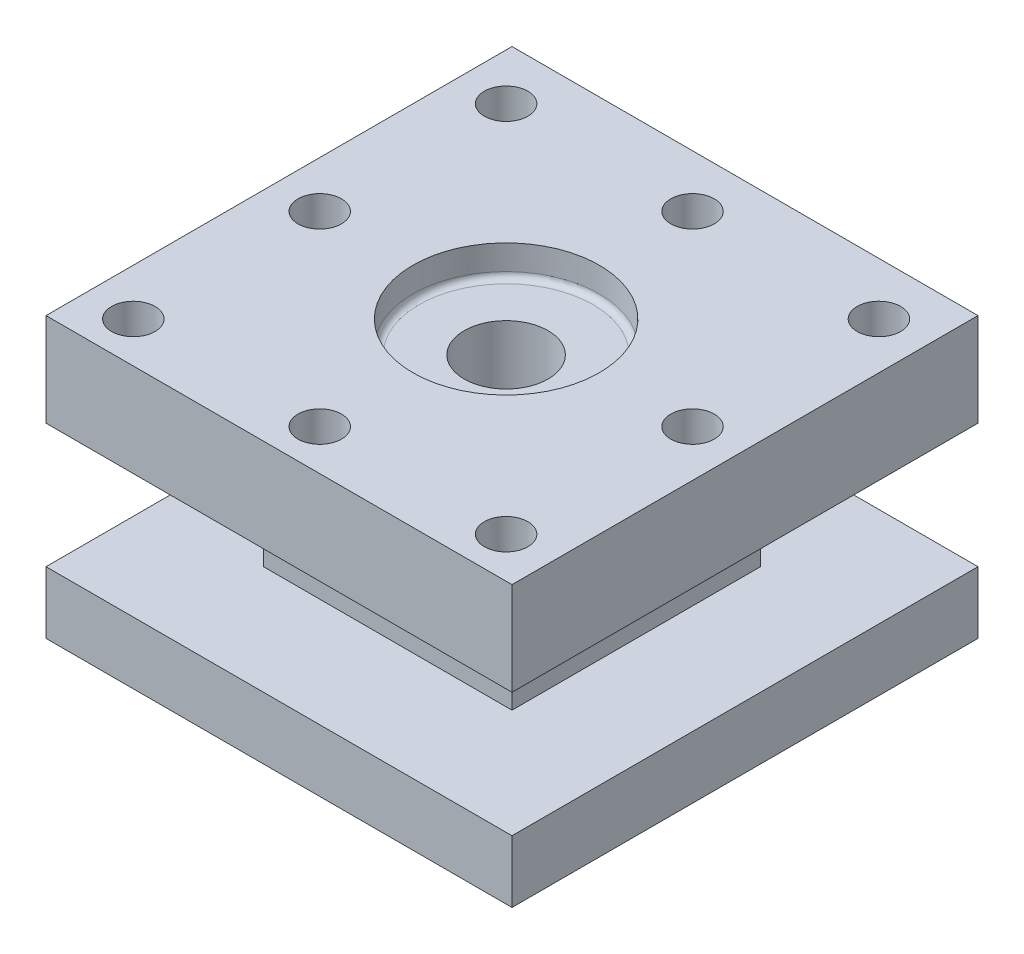
ISO-10303-21;
HEADER;
FILE_DESCRIPTION(('STEP AP214'),'2;1');
FILE_NAME('part.step','',(''),(''),'','','');
FILE_SCHEMA(('AUTOMOTIVE_DESIGN { 1 0 10303 214 1 1 1 1 }'));
ENDSEC;
DATA;
#1=APPLICATION_CONTEXT('core data for automotive mechanical design processes');
#2=APPLICATION_PROTOCOL_DEFINITION('international standard','automotive_design',2000,#1);
#3=PRODUCT_CONTEXT('',#1,'mechanical');
#4=PRODUCT('Part','Part','',(#3));
#5=PRODUCT_RELATED_PRODUCT_CATEGORY('part','',(#4));
#6=PRODUCT_DEFINITION_FORMATION('','',#4);
#7=PRODUCT_DEFINITION_CONTEXT('part definition',#1,'design');
#8=PRODUCT_DEFINITION('design','',#6,#7);
#9=PRODUCT_DEFINITION_SHAPE('','',#8);
#10=(LENGTH_UNIT() NAMED_UNIT(*) SI_UNIT(.MILLI.,.METRE.));
#11=(NAMED_UNIT(*) PLANE_ANGLE_UNIT() SI_UNIT($,.RADIAN.));
#12=(NAMED_UNIT(*) SI_UNIT($,.STERADIAN.) SOLID_ANGLE_UNIT());
#13=UNCERTAINTY_MEASURE_WITH_UNIT(LENGTH_MEASURE(1.E-05),#10,'distance_accuracy_value','');
#14=(GEOMETRIC_REPRESENTATION_CONTEXT(3) GLOBAL_UNCERTAINTY_ASSIGNED_CONTEXT((#13)) GLOBAL_UNIT_ASSIGNED_CONTEXT((#10,
#11,#12)) REPRESENTATION_CONTEXT('',''));
#15=CARTESIAN_POINT('',(0.,0.,0.));
#16=DIRECTION('',(0.,0.,1.));
#17=DIRECTION('',(1.,0.,0.));
#18=AXIS2_PLACEMENT_3D('',#15,#16,#17);
#19=CARTESIAN_POINT('',(0.,-30.,0.));
#20=DIRECTION('',(0.,1.,0.));
#21=DIRECTION('',(0.,0.,1.));
#22=AXIS2_PLACEMENT_3D('',#19,#20,#21);
#23=PLANE('',#22);
#24=DIRECTION('',(-1.,0.,0.));
#25=VECTOR('',#24,1.);
#26=CARTESIAN_POINT('',(40.,-30.,43.));
#27=LINE('',#26,#25);
#28=CARTESIAN_POINT('',(-43.,-30.,43.));
#29=VERTEX_POINT('',#28);
#30=CARTESIAN_POINT('',(43.,-30.,43.));
#31=VERTEX_POINT('',#30);
#32=EDGE_CURVE('E399',#29,#31,#27,.F.);
#33=ORIENTED_EDGE('',*,*,#32,.T.);
#34=DIRECTION('',(0.,0.,1.));
#35=VECTOR('',#34,1.);
#36=CARTESIAN_POINT('',(43.,-30.,-40.));
#37=LINE('',#36,#35);
#38=CARTESIAN_POINT('',(43.,-30.,-43.));
#39=VERTEX_POINT('',#38);
#40=EDGE_CURVE('E410',#31,#39,#37,.F.);
#41=ORIENTED_EDGE('',*,*,#40,.T.);
#42=DIRECTION('',(1.,0.,0.));
#43=VECTOR('',#42,1.);
#44=CARTESIAN_POINT('',(-40.,-30.,-43.));
#45=LINE('',#44,#43);
#46=CARTESIAN_POINT('',(-43.,-30.,-43.));
#47=VERTEX_POINT('',#46);
#48=EDGE_CURVE('E404',#39,#47,#45,.F.);
#49=ORIENTED_EDGE('',*,*,#48,.T.);
#50=DIRECTION('',(0.,0.,-1.));
#51=VECTOR('',#50,1.);
#52=CARTESIAN_POINT('',(-43.,-30.,40.));
#53=LINE('',#52,#51);
#54=EDGE_CURVE('E402',#47,#29,#53,.F.);
#55=ORIENTED_EDGE('',*,*,#54,.T.);
#56=EDGE_LOOP('',(#33,#41,#49,#55));
#57=FACE_BOUND('',#56,.T.);
#58=CARTESIAN_POINT('',(60.,-30.,61.8916213058325));
#59=DIRECTION('',(0.,1.,0.));
#60=DIRECTION('',(0.,0.,1.));
#61=AXIS2_PLACEMENT_3D('',#58,#59,#60);
#62=CIRCLE('',#61,6.99999999999999);
#63=CARTESIAN_POINT('',(60.,-30.,68.8916213058325));
#64=VERTEX_POINT('',#63);
#65=EDGE_CURVE('E210',#64,#64,#62,.T.);
#66=ORIENTED_EDGE('',*,*,#65,.T.);
#67=EDGE_LOOP('',(#66));
#68=FACE_BOUND('',#67,.T.);
#69=CARTESIAN_POINT('',(-60.,-30.,-58.1083786941675));
#70=DIRECTION('',(0.,1.,0.));
#71=DIRECTION('',(0.,0.,1.));
#72=AXIS2_PLACEMENT_3D('',#69,#70,#71);
#73=CIRCLE('',#72,6.99999999999999);
#74=CARTESIAN_POINT('',(-60.,-30.,-51.1083786941675));
#75=VERTEX_POINT('',#74);
#76=EDGE_CURVE('E214',#75,#75,#73,.T.);
#77=ORIENTED_EDGE('',*,*,#76,.T.);
#78=EDGE_LOOP('',(#77));
#79=FACE_BOUND('',#78,.T.);
#80=CARTESIAN_POINT('',(-60.,-30.,61.8916213058325));
#81=DIRECTION('',(0.,1.,0.));
#82=DIRECTION('',(0.,0.,1.));
#83=AXIS2_PLACEMENT_3D('',#80,#81,#82);
#84=CIRCLE('',#83,6.99999999999999);
#85=CARTESIAN_POINT('',(-60.,-30.,68.8916213058325));
#86=VERTEX_POINT('',#85);
#87=EDGE_CURVE('E224',#86,#86,#84,.T.);
#88=ORIENTED_EDGE('',*,*,#87,.T.);
#89=EDGE_LOOP('',(#88));
#90=FACE_BOUND('',#89,.T.);
#91=CARTESIAN_POINT('',(60.,-30.,-58.1083786941675));
#92=DIRECTION('',(0.,1.,0.));
#93=DIRECTION('',(0.,0.,1.));
#94=AXIS2_PLACEMENT_3D('',#91,#92,#93);
#95=CIRCLE('',#94,6.99999999999999);
#96=CARTESIAN_POINT('',(60.,-30.,-51.1083786941675));
#97=VERTEX_POINT('',#96);
#98=EDGE_CURVE('E231',#97,#97,#95,.T.);
#99=ORIENTED_EDGE('',*,*,#98,.T.);
#100=EDGE_LOOP('',(#99));
#101=FACE_BOUND('',#100,.T.);
#102=CARTESIAN_POINT('',(0.,-30.,-58.1083786941675));
#103=DIRECTION('',(0.,1.,0.));
#104=DIRECTION('',(0.,0.,1.));
#105=AXIS2_PLACEMENT_3D('',#102,#103,#104);
#106=CIRCLE('',#105,6.99999999999999);
#107=CARTESIAN_POINT('',(0.,-30.,-51.1083786941675));
#108=VERTEX_POINT('',#107);
#109=EDGE_CURVE('E239',#108,#108,#106,.T.);
#110=ORIENTED_EDGE('',*,*,#109,.T.);
#111=EDGE_LOOP('',(#110));
#112=FACE_BOUND('',#111,.T.);
#113=CARTESIAN_POINT('',(-60.,-30.,1.89162130583248));
#114=DIRECTION('',(0.,1.,0.));
#115=DIRECTION('',(0.,0.,1.));
#116=AXIS2_PLACEMENT_3D('',#113,#114,#115);
#117=CIRCLE('',#116,6.99999999999999);
#118=CARTESIAN_POINT('',(-60.,-30.,8.89162130583247));
#119=VERTEX_POINT('',#118);
#120=EDGE_CURVE('E247',#119,#119,#117,.T.);
#121=ORIENTED_EDGE('',*,*,#120,.T.);
#122=EDGE_LOOP('',(#121));
#123=FACE_BOUND('',#122,.T.);
#124=CARTESIAN_POINT('',(60.,-30.,1.89162130583248));
#125=DIRECTION('',(0.,1.,0.));
#126=DIRECTION('',(0.,0.,1.));
#127=AXIS2_PLACEMENT_3D('',#124,#125,#126);
#128=CIRCLE('',#127,6.99999999999999);
#129=CARTESIAN_POINT('',(60.,-30.,8.89162130583247));
#130=VERTEX_POINT('',#129);
#131=EDGE_CURVE('E254',#130,#130,#128,.T.);
#132=ORIENTED_EDGE('',*,*,#131,.T.);
#133=EDGE_LOOP('',(#132));
#134=FACE_BOUND('',#133,.T.);
#135=CARTESIAN_POINT('',(0.,-30.,61.8916213058325));
#136=DIRECTION('',(0.,1.,0.));
#137=DIRECTION('',(0.,0.,1.));
#138=AXIS2_PLACEMENT_3D('',#135,#136,#137);
#139=CIRCLE('',#138,6.99999999999999);
#140=CARTESIAN_POINT('',(0.,-30.,68.8916213058325));
#141=VERTEX_POINT('',#140);
#142=EDGE_CURVE('E263',#141,#141,#139,.T.);
#143=ORIENTED_EDGE('',*,*,#142,.T.);
#144=EDGE_LOOP('',(#143));
#145=FACE_BOUND('',#144,.T.);
#146=DIRECTION('',(0.,0.,-1.));
#147=VECTOR('',#146,1.);
#148=CARTESIAN_POINT('',(75.,-30.,-75.));
#149=LINE('',#148,#147);
#150=CARTESIAN_POINT('',(75.,-30.,75.));
#151=VERTEX_POINT('',#150);
#152=CARTESIAN_POINT('',(75.,-30.,-75.));
#153=VERTEX_POINT('',#152);
#154=EDGE_CURVE('E353',#151,#153,#149,.T.);
#155=ORIENTED_EDGE('',*,*,#154,.F.);
#156=DIRECTION('',(1.,0.,0.));
#157=VECTOR('',#156,1.);
#158=CARTESIAN_POINT('',(-75.,-30.,75.));
#159=LINE('',#158,#157);
#160=CARTESIAN_POINT('',(-75.,-30.,75.));
#161=VERTEX_POINT('',#160);
#162=EDGE_CURVE('E365',#161,#151,#159,.T.);
#163=ORIENTED_EDGE('',*,*,#162,.F.);
#164=DIRECTION('',(0.,0.,1.));
#165=VECTOR('',#164,1.);
#166=CARTESIAN_POINT('',(-75.,-30.,-75.));
#167=LINE('',#166,#165);
#168=CARTESIAN_POINT('',(-75.,-30.,-75.));
#169=VERTEX_POINT('',#168);
#170=EDGE_CURVE('E360',#169,#161,#167,.T.);
#171=ORIENTED_EDGE('',*,*,#170,.F.);
#172=DIRECTION('',(-1.,0.,0.));
#173=VECTOR('',#172,1.);
#174=CARTESIAN_POINT('',(-75.,-30.,-75.));
#175=LINE('',#174,#173);
#176=EDGE_CURVE('E352',#153,#169,#175,.T.);
#177=ORIENTED_EDGE('',*,*,#176,.F.);
#178=EDGE_LOOP('',(#155,#163,#171,#177));
#179=FACE_BOUND('',#178,.T.);
#180=ADVANCED_FACE('F48',(#57,#68,#79,#90,#101,#112,#123,#134,#145,#179),#23,.F.);
#181=CARTESIAN_POINT('',(75.,-30.,-75.));
#182=DIRECTION('',(1.,0.,0.));
#183=DIRECTION('',(0.,0.,-1.));
#184=AXIS2_PLACEMENT_3D('',#181,#182,#183);
#185=PLANE('',#184);
#186=DIRECTION('',(0.,0.,-1.));
#187=VECTOR('',#186,1.);
#188=CARTESIAN_POINT('',(75.,0.,-75.));
#189=LINE('',#188,#187);
#190=CARTESIAN_POINT('',(75.,0.,75.));
#191=VERTEX_POINT('',#190);
#192=CARTESIAN_POINT('',(75.,0.,-75.));
#193=VERTEX_POINT('',#192);
#194=EDGE_CURVE('E348',#191,#193,#189,.T.);
#195=ORIENTED_EDGE('',*,*,#194,.F.);
#196=DIRECTION('',(0.,1.,0.));
#197=VECTOR('',#196,1.);
#198=CARTESIAN_POINT('',(75.,-30.,75.));
#199=LINE('',#198,#197);
#200=EDGE_CURVE('E382',#151,#191,#199,.T.);
#201=ORIENTED_EDGE('',*,*,#200,.F.);
#202=ORIENTED_EDGE('',*,*,#154,.T.);
#203=DIRECTION('',(0.,1.,0.));
#204=VECTOR('',#203,1.);
#205=CARTESIAN_POINT('',(75.,-30.,-75.));
#206=LINE('',#205,#204);
#207=EDGE_CURVE('E366',#153,#193,#206,.T.);
#208=ORIENTED_EDGE('',*,*,#207,.T.);
#209=EDGE_LOOP('',(#195,#201,#202,#208));
#210=FACE_BOUND('',#209,.T.);
#211=ADVANCED_FACE('F449',(#210),#185,.T.);
#212=CARTESIAN_POINT('',(-75.,-30.,75.));
#213=DIRECTION('',(0.,0.,1.));
#214=DIRECTION('',(1.,0.,0.));
#215=AXIS2_PLACEMENT_3D('',#212,#213,#214);
#216=PLANE('',#215);
#217=DIRECTION('',(1.,0.,0.));
#218=VECTOR('',#217,1.);
#219=CARTESIAN_POINT('',(-75.,0.,75.));
#220=LINE('',#219,#218);
#221=CARTESIAN_POINT('',(-75.,0.,75.));
#222=VERTEX_POINT('',#221);
#223=EDGE_CURVE('E356',#222,#191,#220,.T.);
#224=ORIENTED_EDGE('',*,*,#223,.F.);
#225=DIRECTION('',(0.,1.,0.));
#226=VECTOR('',#225,1.);
#227=CARTESIAN_POINT('',(-75.,-30.,75.));
#228=LINE('',#227,#226);
#229=EDGE_CURVE('E390',#161,#222,#228,.T.);
#230=ORIENTED_EDGE('',*,*,#229,.F.);
#231=ORIENTED_EDGE('',*,*,#162,.T.);
#232=ORIENTED_EDGE('',*,*,#200,.T.);
#233=EDGE_LOOP('',(#224,#230,#231,#232));
#234=FACE_BOUND('',#233,.T.);
#235=ADVANCED_FACE('F460',(#234),#216,.T.);
#236=CARTESIAN_POINT('',(-75.,-30.,-75.));
#237=DIRECTION('',(-1.,0.,0.));
#238=DIRECTION('',(0.,0.,1.));
#239=AXIS2_PLACEMENT_3D('',#236,#237,#238);
#240=PLANE('',#239);
#241=DIRECTION('',(0.,0.,1.));
#242=VECTOR('',#241,1.);
#243=CARTESIAN_POINT('',(-75.,0.,-75.));
#244=LINE('',#243,#242);
#245=CARTESIAN_POINT('',(-75.,0.,-75.));
#246=VERTEX_POINT('',#245);
#247=EDGE_CURVE('E376',#246,#222,#244,.T.);
#248=ORIENTED_EDGE('',*,*,#247,.F.);
#249=DIRECTION('',(0.,1.,0.));
#250=VECTOR('',#249,1.);
#251=CARTESIAN_POINT('',(-75.,-30.,-75.));
#252=LINE('',#251,#250);
#253=EDGE_CURVE('E388',#169,#246,#252,.T.);
#254=ORIENTED_EDGE('',*,*,#253,.F.);
#255=ORIENTED_EDGE('',*,*,#170,.T.);
#256=ORIENTED_EDGE('',*,*,#229,.T.);
#257=EDGE_LOOP('',(#248,#254,#255,#256));
#258=FACE_BOUND('',#257,.T.);
#259=ADVANCED_FACE('F472',(#258),#240,.T.);
#260=CARTESIAN_POINT('',(-75.,-30.,-75.));
#261=DIRECTION('',(0.,0.,-1.));
#262=DIRECTION('',(-1.,0.,0.));
#263=AXIS2_PLACEMENT_3D('',#260,#261,#262);
#264=PLANE('',#263);
#265=DIRECTION('',(-1.,0.,0.));
#266=VECTOR('',#265,1.);
#267=CARTESIAN_POINT('',(-75.,0.,-75.));
#268=LINE('',#267,#266);
#269=EDGE_CURVE('E375',#193,#246,#268,.T.);
#270=ORIENTED_EDGE('',*,*,#269,.F.);
#271=ORIENTED_EDGE('',*,*,#207,.F.);
#272=ORIENTED_EDGE('',*,*,#176,.T.);
#273=ORIENTED_EDGE('',*,*,#253,.T.);
#274=EDGE_LOOP('',(#270,#271,#272,#273));
#275=FACE_BOUND('',#274,.T.);
#276=ADVANCED_FACE('F469',(#275),#264,.T.);
#277=CARTESIAN_POINT('',(0.,0.,0.));
#278=DIRECTION('',(0.,1.,0.));
#279=DIRECTION('',(0.,0.,1.));
#280=AXIS2_PLACEMENT_3D('',#277,#278,#279);
#281=PLANE('',#280);
#282=CARTESIAN_POINT('',(60.,0.,61.8916213058325));
#283=DIRECTION('',(0.,1.,0.));
#284=DIRECTION('',(0.,0.,1.));
#285=AXIS2_PLACEMENT_3D('',#282,#283,#284);
#286=CIRCLE('',#285,6.99999999999999);
#287=CARTESIAN_POINT('',(60.,0.,68.8916213058325));
#288=VERTEX_POINT('',#287);
#289=EDGE_CURVE('E201',#288,#288,#286,.T.);
#290=ORIENTED_EDGE('',*,*,#289,.F.);
#291=EDGE_LOOP('',(#290));
#292=FACE_BOUND('',#291,.T.);
#293=CARTESIAN_POINT('',(-60.,0.,-58.1083786941675));
#294=DIRECTION('',(0.,1.,0.));
#295=DIRECTION('',(0.,0.,1.));
#296=AXIS2_PLACEMENT_3D('',#293,#294,#295);
#297=CIRCLE('',#296,6.99999999999999);
#298=CARTESIAN_POINT('',(-60.,0.,-51.1083786941675));
#299=VERTEX_POINT('',#298);
#300=EDGE_CURVE('E211',#299,#299,#297,.T.);
#301=ORIENTED_EDGE('',*,*,#300,.F.);
#302=EDGE_LOOP('',(#301));
#303=FACE_BOUND('',#302,.T.);
#304=CARTESIAN_POINT('',(-60.,0.,61.8916213058325));
#305=DIRECTION('',(0.,1.,0.));
#306=DIRECTION('',(0.,0.,1.));
#307=AXIS2_PLACEMENT_3D('',#304,#305,#306);
#308=CIRCLE('',#307,6.99999999999999);
#309=CARTESIAN_POINT('',(-60.,0.,68.8916213058325));
#310=VERTEX_POINT('',#309);
#311=EDGE_CURVE('E218',#310,#310,#308,.T.);
#312=ORIENTED_EDGE('',*,*,#311,.F.);
#313=EDGE_LOOP('',(#312));
#314=FACE_BOUND('',#313,.T.);
#315=CARTESIAN_POINT('',(60.,0.,-58.1083786941675));
#316=DIRECTION('',(0.,1.,0.));
#317=DIRECTION('',(0.,0.,1.));
#318=AXIS2_PLACEMENT_3D('',#315,#316,#317);
#319=CIRCLE('',#318,6.99999999999999);
#320=CARTESIAN_POINT('',(60.,0.,-51.1083786941675));
#321=VERTEX_POINT('',#320);
#322=EDGE_CURVE('E230',#321,#321,#319,.T.);
#323=ORIENTED_EDGE('',*,*,#322,.F.);
#324=EDGE_LOOP('',(#323));
#325=FACE_BOUND('',#324,.T.);
#326=CARTESIAN_POINT('',(0.,0.,-58.1083786941675));
#327=DIRECTION('',(0.,1.,0.));
#328=DIRECTION('',(0.,0.,1.));
#329=AXIS2_PLACEMENT_3D('',#326,#327,#328);
#330=CIRCLE('',#329,6.99999999999999);
#331=CARTESIAN_POINT('',(0.,0.,-51.1083786941675));
#332=VERTEX_POINT('',#331);
#333=EDGE_CURVE('E235',#332,#332,#330,.T.);
#334=ORIENTED_EDGE('',*,*,#333,.F.);
#335=EDGE_LOOP('',(#334));
#336=FACE_BOUND('',#335,.T.);
#337=CARTESIAN_POINT('',(-60.,0.,1.89162130583248));
#338=DIRECTION('',(0.,1.,0.));
#339=DIRECTION('',(0.,0.,1.));
#340=AXIS2_PLACEMENT_3D('',#337,#338,#339);
#341=CIRCLE('',#340,6.99999999999999);
#342=CARTESIAN_POINT('',(-60.,0.,8.89162130583247));
#343=VERTEX_POINT('',#342);
#344=EDGE_CURVE('E241',#343,#343,#341,.T.);
#345=ORIENTED_EDGE('',*,*,#344,.F.);
#346=EDGE_LOOP('',(#345));
#347=FACE_BOUND('',#346,.T.);
#348=CARTESIAN_POINT('',(60.,0.,1.89162130583248));
#349=DIRECTION('',(0.,1.,0.));
#350=DIRECTION('',(0.,0.,1.));
#351=AXIS2_PLACEMENT_3D('',#348,#349,#350);
#352=CIRCLE('',#351,6.99999999999999);
#353=CARTESIAN_POINT('',(60.,0.,8.89162130583247));
#354=VERTEX_POINT('',#353);
#355=EDGE_CURVE('E253',#354,#354,#352,.T.);
#356=ORIENTED_EDGE('',*,*,#355,.F.);
#357=EDGE_LOOP('',(#356));
#358=FACE_BOUND('',#357,.T.);
#359=CARTESIAN_POINT('',(0.,0.,61.8916213058325));
#360=DIRECTION('',(0.,1.,0.));
#361=DIRECTION('',(0.,0.,1.));
#362=AXIS2_PLACEMENT_3D('',#359,#360,#361);
#363=CIRCLE('',#362,6.99999999999999);
#364=CARTESIAN_POINT('',(0.,0.,68.8916213058325));
#365=VERTEX_POINT('',#364);
#366=EDGE_CURVE('E259',#365,#365,#363,.T.);
#367=ORIENTED_EDGE('',*,*,#366,.F.);
#368=EDGE_LOOP('',(#367));
#369=FACE_BOUND('',#368,.T.);
#370=CARTESIAN_POINT('',(0.,0.,1.89162130583249));
#371=DIRECTION('',(0.,1.,0.));
#372=DIRECTION('',(0.,0.,1.));
#373=AXIS2_PLACEMENT_3D('',#370,#371,#372);
#374=CIRCLE('',#373,30.);
#375=CARTESIAN_POINT('',(0.,0.,31.8916213058325));
#376=VERTEX_POINT('',#375);
#377=EDGE_CURVE('E270',#376,#376,#374,.T.);
#378=ORIENTED_EDGE('',*,*,#377,.F.);
#379=EDGE_LOOP('',(#378));
#380=FACE_BOUND('',#379,.T.);
#381=ORIENTED_EDGE('',*,*,#194,.T.);
#382=ORIENTED_EDGE('',*,*,#269,.T.);
#383=ORIENTED_EDGE('',*,*,#247,.T.);
#384=ORIENTED_EDGE('',*,*,#223,.T.);
#385=EDGE_LOOP('',(#381,#382,#383,#384));
#386=FACE_BOUND('',#385,.T.);
#387=ADVANCED_FACE('F462',(#292,#303,#314,#325,#336,#347,#358,#369,#380,#386),#281,.T.);
#388=CARTESIAN_POINT('',(40.,-70.,-40.));
#389=DIRECTION('',(-1.,0.,0.));
#390=DIRECTION('',(0.,0.,1.));
#391=AXIS2_PLACEMENT_3D('',#388,#389,#390);
#392=PLANE('',#391);
#393=DIRECTION('',(0.,1.,0.));
#394=VECTOR('',#393,1.);
#395=CARTESIAN_POINT('',(40.,-70.,-40.));
#396=LINE('',#395,#394);
#397=CARTESIAN_POINT('',(40.,-70.,-40.));
#398=VERTEX_POINT('',#397);
#399=CARTESIAN_POINT('',(40.,-33.,-40.));
#400=VERTEX_POINT('',#399);
#401=EDGE_CURVE('E340',#398,#400,#396,.T.);
#402=ORIENTED_EDGE('',*,*,#401,.T.);
#403=DIRECTION('',(0.,0.,1.));
#404=VECTOR('',#403,1.);
#405=CARTESIAN_POINT('',(40.,-33.,40.));
#406=LINE('',#405,#404);
#407=CARTESIAN_POINT('',(40.,-33.,40.));
#408=VERTEX_POINT('',#407);
#409=EDGE_CURVE('E387',#400,#408,#406,.T.);
#410=ORIENTED_EDGE('',*,*,#409,.T.);
#411=DIRECTION('',(0.,1.,0.));
#412=VECTOR('',#411,1.);
#413=CARTESIAN_POINT('',(40.,-70.,40.));
#414=LINE('',#413,#412);
#415=CARTESIAN_POINT('',(40.,-70.,40.));
#416=VERTEX_POINT('',#415);
#417=EDGE_CURVE('E350',#416,#408,#414,.T.);
#418=ORIENTED_EDGE('',*,*,#417,.F.);
#419=DIRECTION('',(0.,0.,1.));
#420=VECTOR('',#419,1.);
#421=CARTESIAN_POINT('',(40.,-70.,-40.));
#422=LINE('',#421,#420);
#423=EDGE_CURVE('E321',#398,#416,#422,.T.);
#424=ORIENTED_EDGE('',*,*,#423,.F.);
#425=EDGE_LOOP('',(#402,#410,#418,#424));
#426=FACE_BOUND('',#425,.T.);
#427=ADVANCED_FACE('F461',(#426),#392,.F.);
#428=CARTESIAN_POINT('',(-40.,-70.,40.));
#429=DIRECTION('',(0.,0.,-1.));
#430=DIRECTION('',(-1.,0.,0.));
#431=AXIS2_PLACEMENT_3D('',#428,#429,#430);
#432=PLANE('',#431);
#433=ORIENTED_EDGE('',*,*,#417,.T.);
#434=DIRECTION('',(-1.,0.,0.));
#435=VECTOR('',#434,1.);
#436=CARTESIAN_POINT('',(-40.,-33.,40.));
#437=LINE('',#436,#435);
#438=CARTESIAN_POINT('',(-40.,-33.,40.));
#439=VERTEX_POINT('',#438);
#440=EDGE_CURVE('E64',#408,#439,#437,.T.);
#441=ORIENTED_EDGE('',*,*,#440,.T.);
#442=DIRECTION('',(0.,1.,0.));
#443=VECTOR('',#442,1.);
#444=CARTESIAN_POINT('',(-40.,-70.,40.));
#445=LINE('',#444,#443);
#446=CARTESIAN_POINT('',(-40.,-70.,40.));
#447=VERTEX_POINT('',#446);
#448=EDGE_CURVE('E343',#447,#439,#445,.T.);
#449=ORIENTED_EDGE('',*,*,#448,.F.);
#450=DIRECTION('',(-1.,0.,0.));
#451=VECTOR('',#450,1.);
#452=CARTESIAN_POINT('',(-40.,-70.,40.));
#453=LINE('',#452,#451);
#454=EDGE_CURVE('E324',#416,#447,#453,.T.);
#455=ORIENTED_EDGE('',*,*,#454,.F.);
#456=EDGE_LOOP('',(#433,#441,#449,#455));
#457=FACE_BOUND('',#456,.T.);
#458=ADVANCED_FACE('F511',(#457),#432,.F.);
#459=CARTESIAN_POINT('',(-40.,-70.,-40.));
#460=DIRECTION('',(1.,0.,0.));
#461=DIRECTION('',(0.,0.,-1.));
#462=AXIS2_PLACEMENT_3D('',#459,#460,#461);
#463=PLANE('',#462);
#464=ORIENTED_EDGE('',*,*,#448,.T.);
#465=DIRECTION('',(0.,0.,-1.));
#466=VECTOR('',#465,1.);
#467=CARTESIAN_POINT('',(-40.,-33.,-40.));
#468=LINE('',#467,#466);
#469=CARTESIAN_POINT('',(-40.,-33.,-40.));
#470=VERTEX_POINT('',#469);
#471=EDGE_CURVE('E72',#439,#470,#468,.T.);
#472=ORIENTED_EDGE('',*,*,#471,.T.);
#473=DIRECTION('',(0.,1.,0.));
#474=VECTOR('',#473,1.);
#475=CARTESIAN_POINT('',(-40.,-70.,-40.));
#476=LINE('',#475,#474);
#477=CARTESIAN_POINT('',(-40.,-70.,-40.));
#478=VERTEX_POINT('',#477);
#479=EDGE_CURVE('E341',#478,#470,#476,.T.);
#480=ORIENTED_EDGE('',*,*,#479,.F.);
#481=DIRECTION('',(0.,0.,-1.));
#482=VECTOR('',#481,1.);
#483=CARTESIAN_POINT('',(-40.,-70.,-40.));
#484=LINE('',#483,#482);
#485=EDGE_CURVE('E328',#447,#478,#484,.T.);
#486=ORIENTED_EDGE('',*,*,#485,.F.);
#487=EDGE_LOOP('',(#464,#472,#480,#486));
#488=FACE_BOUND('',#487,.T.);
#489=ADVANCED_FACE('F515',(#488),#463,.F.);
#490=CARTESIAN_POINT('',(-40.,-70.,-40.));
#491=DIRECTION('',(0.,0.,1.));
#492=DIRECTION('',(1.,0.,0.));
#493=AXIS2_PLACEMENT_3D('',#490,#491,#492);
#494=PLANE('',#493);
#495=ORIENTED_EDGE('',*,*,#479,.T.);
#496=DIRECTION('',(1.,0.,0.));
#497=VECTOR('',#496,1.);
#498=CARTESIAN_POINT('',(40.,-33.,-40.));
#499=LINE('',#498,#497);
#500=EDGE_CURVE('E411',#470,#400,#499,.T.);
#501=ORIENTED_EDGE('',*,*,#500,.T.);
#502=ORIENTED_EDGE('',*,*,#401,.F.);
#503=DIRECTION('',(1.,0.,0.));
#504=VECTOR('',#503,1.);
#505=CARTESIAN_POINT('',(-40.,-70.,-40.));
#506=LINE('',#505,#504);
#507=EDGE_CURVE('E334',#478,#398,#506,.T.);
#508=ORIENTED_EDGE('',*,*,#507,.F.);
#509=EDGE_LOOP('',(#495,#501,#502,#508));
#510=FACE_BOUND('',#509,.T.);
#511=ADVANCED_FACE('F502',(#510),#494,.F.);
#512=CARTESIAN_POINT('',(0.,-70.,0.));
#513=DIRECTION('',(0.,-1.,0.));
#514=DIRECTION('',(0.,0.,-1.));
#515=AXIS2_PLACEMENT_3D('',#512,#513,#514);
#516=PLANE('',#515);
#517=DIRECTION('',(0.,0.,-1.));
#518=VECTOR('',#517,1.);
#519=CARTESIAN_POINT('',(-75.,-70.,75.));
#520=LINE('',#519,#518);
#521=CARTESIAN_POINT('',(-75.,-70.,75.));
#522=VERTEX_POINT('',#521);
#523=CARTESIAN_POINT('',(-75.,-70.,-75.));
#524=VERTEX_POINT('',#523);
#525=EDGE_CURVE('E276',#522,#524,#520,.T.);
#526=ORIENTED_EDGE('',*,*,#525,.F.);
#527=DIRECTION('',(-1.,0.,0.));
#528=VECTOR('',#527,1.);
#529=CARTESIAN_POINT('',(75.,-70.,75.));
#530=LINE('',#529,#528);
#531=CARTESIAN_POINT('',(75.,-70.,75.));
#532=VERTEX_POINT('',#531);
#533=EDGE_CURVE('E282',#532,#522,#530,.T.);
#534=ORIENTED_EDGE('',*,*,#533,.F.);
#535=DIRECTION('',(0.,0.,1.));
#536=VECTOR('',#535,1.);
#537=CARTESIAN_POINT('',(75.,-70.,-75.));
#538=LINE('',#537,#536);
#539=CARTESIAN_POINT('',(75.,-70.,-75.));
#540=VERTEX_POINT('',#539);
#541=EDGE_CURVE('E301',#540,#532,#538,.T.);
#542=ORIENTED_EDGE('',*,*,#541,.F.);
#543=DIRECTION('',(1.,0.,0.));
#544=VECTOR('',#543,1.);
#545=CARTESIAN_POINT('',(-75.,-70.,-75.));
#546=LINE('',#545,#544);
#547=EDGE_CURVE('E296',#524,#540,#546,.T.);
#548=ORIENTED_EDGE('',*,*,#547,.F.);
#549=EDGE_LOOP('',(#526,#534,#542,#548));
#550=FACE_BOUND('',#549,.T.);
#551=ORIENTED_EDGE('',*,*,#507,.T.);
#552=ORIENTED_EDGE('',*,*,#423,.T.);
#553=ORIENTED_EDGE('',*,*,#454,.T.);
#554=ORIENTED_EDGE('',*,*,#485,.T.);
#555=EDGE_LOOP('',(#551,#552,#553,#554));
#556=FACE_BOUND('',#555,.T.);
#557=ADVANCED_FACE('F510',(#550,#556),#516,.F.);
#558=CARTESIAN_POINT('',(-75.,-90.,75.));
#559=DIRECTION('',(1.,0.,0.));
#560=DIRECTION('',(0.,0.,-1.));
#561=AXIS2_PLACEMENT_3D('',#558,#559,#560);
#562=PLANE('',#561);
#563=ORIENTED_EDGE('',*,*,#525,.T.);
#564=DIRECTION('',(0.,1.,0.));
#565=VECTOR('',#564,1.);
#566=CARTESIAN_POINT('',(-75.,-90.,-75.));
#567=LINE('',#566,#565);
#568=CARTESIAN_POINT('',(-75.,-90.,-75.));
#569=VERTEX_POINT('',#568);
#570=EDGE_CURVE('E320',#569,#524,#567,.T.);
#571=ORIENTED_EDGE('',*,*,#570,.F.);
#572=DIRECTION('',(0.,0.,-1.));
#573=VECTOR('',#572,1.);
#574=CARTESIAN_POINT('',(-75.,-90.,75.));
#575=LINE('',#574,#573);
#576=CARTESIAN_POINT('',(-75.,-90.,75.));
#577=VERTEX_POINT('',#576);
#578=EDGE_CURVE('E278',#577,#569,#575,.T.);
#579=ORIENTED_EDGE('',*,*,#578,.F.);
#580=DIRECTION('',(0.,1.,0.));
#581=VECTOR('',#580,1.);
#582=CARTESIAN_POINT('',(-75.,-90.,75.));
#583=LINE('',#582,#581);
#584=EDGE_CURVE('E294',#577,#522,#583,.T.);
#585=ORIENTED_EDGE('',*,*,#584,.T.);
#586=EDGE_LOOP('',(#563,#571,#579,#585));
#587=FACE_BOUND('',#586,.T.);
#588=ADVANCED_FACE('F521',(#587),#562,.F.);
#589=CARTESIAN_POINT('',(-75.,-90.,-75.));
#590=DIRECTION('',(0.,0.,1.));
#591=DIRECTION('',(1.,0.,0.));
#592=AXIS2_PLACEMENT_3D('',#589,#590,#591);
#593=PLANE('',#592);
#594=ORIENTED_EDGE('',*,*,#547,.T.);
#595=DIRECTION('',(0.,1.,0.));
#596=VECTOR('',#595,1.);
#597=CARTESIAN_POINT('',(75.,-90.,-75.));
#598=LINE('',#597,#596);
#599=CARTESIAN_POINT('',(75.,-90.,-75.));
#600=VERTEX_POINT('',#599);
#601=EDGE_CURVE('E311',#600,#540,#598,.T.);
#602=ORIENTED_EDGE('',*,*,#601,.F.);
#603=DIRECTION('',(1.,0.,0.));
#604=VECTOR('',#603,1.);
#605=CARTESIAN_POINT('',(-75.,-90.,-75.));
#606=LINE('',#605,#604);
#607=EDGE_CURVE('E284',#569,#600,#606,.T.);
#608=ORIENTED_EDGE('',*,*,#607,.F.);
#609=ORIENTED_EDGE('',*,*,#570,.T.);
#610=EDGE_LOOP('',(#594,#602,#608,#609));
#611=FACE_BOUND('',#610,.T.);
#612=ADVANCED_FACE('F523',(#611),#593,.F.);
#613=CARTESIAN_POINT('',(75.,-90.,-75.));
#614=DIRECTION('',(-1.,0.,0.));
#615=DIRECTION('',(0.,0.,1.));
#616=AXIS2_PLACEMENT_3D('',#613,#614,#615);
#617=PLANE('',#616);
#618=ORIENTED_EDGE('',*,*,#541,.T.);
#619=DIRECTION('',(0.,1.,0.));
#620=VECTOR('',#619,1.);
#621=CARTESIAN_POINT('',(75.,-90.,75.));
#622=LINE('',#621,#620);
#623=CARTESIAN_POINT('',(75.,-90.,75.));
#624=VERTEX_POINT('',#623);
#625=EDGE_CURVE('E310',#624,#532,#622,.T.);
#626=ORIENTED_EDGE('',*,*,#625,.F.);
#627=DIRECTION('',(0.,0.,1.));
#628=VECTOR('',#627,1.);
#629=CARTESIAN_POINT('',(75.,-90.,-75.));
#630=LINE('',#629,#628);
#631=EDGE_CURVE('E289',#600,#624,#630,.T.);
#632=ORIENTED_EDGE('',*,*,#631,.F.);
#633=ORIENTED_EDGE('',*,*,#601,.T.);
#634=EDGE_LOOP('',(#618,#626,#632,#633));
#635=FACE_BOUND('',#634,.T.);
#636=ADVANCED_FACE('F526',(#635),#617,.F.);
#637=CARTESIAN_POINT('',(75.,-90.,75.));
#638=DIRECTION('',(0.,0.,-1.));
#639=DIRECTION('',(-1.,0.,0.));
#640=AXIS2_PLACEMENT_3D('',#637,#638,#639);
#641=PLANE('',#640);
#642=ORIENTED_EDGE('',*,*,#533,.T.);
#643=ORIENTED_EDGE('',*,*,#584,.F.);
#644=DIRECTION('',(-1.,0.,0.));
#645=VECTOR('',#644,1.);
#646=CARTESIAN_POINT('',(75.,-90.,75.));
#647=LINE('',#646,#645);
#648=EDGE_CURVE('E292',#624,#577,#647,.T.);
#649=ORIENTED_EDGE('',*,*,#648,.F.);
#650=ORIENTED_EDGE('',*,*,#625,.T.);
#651=EDGE_LOOP('',(#642,#643,#649,#650));
#652=FACE_BOUND('',#651,.T.);
#653=ADVANCED_FACE('F535',(#652),#641,.F.);
#654=CARTESIAN_POINT('',(0.,-90.,0.));
#655=DIRECTION('',(0.,-1.,0.));
#656=DIRECTION('',(0.,0.,-1.));
#657=AXIS2_PLACEMENT_3D('',#654,#655,#656);
#658=PLANE('',#657);
#659=CARTESIAN_POINT('',(0.,-90.,-58.1083786941675));
#660=DIRECTION('',(0.,-1.,0.));
#661=DIRECTION('',(0.,0.,-1.));
#662=AXIS2_PLACEMENT_3D('',#659,#660,#661);
#663=CIRCLE('',#662,4.99999999999999);
#664=CARTESIAN_POINT('',(0.,-90.,-63.1083786941675));
#665=VERTEX_POINT('',#664);
#666=EDGE_CURVE('E171',#665,#665,#663,.T.);
#667=ORIENTED_EDGE('',*,*,#666,.F.);
#668=EDGE_LOOP('',(#667));
#669=FACE_BOUND('',#668,.T.);
#670=CARTESIAN_POINT('',(60.,-90.,1.89162130583249));
#671=DIRECTION('',(0.,-1.,0.));
#672=DIRECTION('',(0.,0.,-1.));
#673=AXIS2_PLACEMENT_3D('',#670,#671,#672);
#674=CIRCLE('',#673,4.99999999999998);
#675=CARTESIAN_POINT('',(60.,-90.,-3.1083786941675));
#676=VERTEX_POINT('',#675);
#677=EDGE_CURVE('E175',#676,#676,#674,.T.);
#678=ORIENTED_EDGE('',*,*,#677,.F.);
#679=EDGE_LOOP('',(#678));
#680=FACE_BOUND('',#679,.T.);
#681=CARTESIAN_POINT('',(-60.,-90.,1.89162130583249));
#682=DIRECTION('',(0.,-1.,0.));
#683=DIRECTION('',(0.,0.,-1.));
#684=AXIS2_PLACEMENT_3D('',#681,#682,#683);
#685=CIRCLE('',#684,4.99999999999999);
#686=CARTESIAN_POINT('',(-60.,-90.,-3.1083786941675));
#687=VERTEX_POINT('',#686);
#688=EDGE_CURVE('E190',#687,#687,#685,.T.);
#689=ORIENTED_EDGE('',*,*,#688,.F.);
#690=EDGE_LOOP('',(#689));
#691=FACE_BOUND('',#690,.T.);
#692=CARTESIAN_POINT('',(0.,-90.,61.8916213058325));
#693=DIRECTION('',(0.,-1.,0.));
#694=DIRECTION('',(0.,0.,-1.));
#695=AXIS2_PLACEMENT_3D('',#692,#693,#694);
#696=CIRCLE('',#695,4.99999999999999);
#697=CARTESIAN_POINT('',(0.,-90.,56.8916213058325));
#698=VERTEX_POINT('',#697);
#699=EDGE_CURVE('E195',#698,#698,#696,.T.);
#700=ORIENTED_EDGE('',*,*,#699,.F.);
#701=EDGE_LOOP('',(#700));
#702=FACE_BOUND('',#701,.T.);
#703=CARTESIAN_POINT('',(0.,-90.,1.89162130583249));
#704=DIRECTION('',(0.,1.,0.));
#705=DIRECTION('',(0.,0.,1.));
#706=AXIS2_PLACEMENT_3D('',#703,#704,#705);
#707=CIRCLE('',#706,13.5);
#708=CARTESIAN_POINT('',(0.,-90.,15.3916213058325));
#709=VERTEX_POINT('',#708);
#710=EDGE_CURVE('E274',#709,#709,#707,.T.);
#711=ORIENTED_EDGE('',*,*,#710,.T.);
#712=EDGE_LOOP('',(#711));
#713=FACE_BOUND('',#712,.T.);
#714=ORIENTED_EDGE('',*,*,#578,.T.);
#715=ORIENTED_EDGE('',*,*,#607,.T.);
#716=ORIENTED_EDGE('',*,*,#631,.T.);
#717=ORIENTED_EDGE('',*,*,#648,.T.);
#718=EDGE_LOOP('',(#714,#715,#716,#717));
#719=FACE_BOUND('',#718,.T.);
#720=ADVANCED_FACE('F536',(#669,#680,#691,#702,#713,#719),#658,.T.);
#721=CARTESIAN_POINT('',(0.,0.,1.89162130583249));
#722=DIRECTION('',(0.,1.,0.));
#723=DIRECTION('',(0.,0.,1.));
#724=AXIS2_PLACEMENT_3D('',#721,#722,#723);
#725=CYLINDRICAL_SURFACE('',#724,13.5);
#726=ORIENTED_EDGE('',*,*,#710,.F.);
#727=EDGE_LOOP('',(#726));
#728=FACE_BOUND('',#727,.T.);
#729=CARTESIAN_POINT('',(0.,-10.,1.89162130583249));
#730=DIRECTION('',(0.,1.,0.));
#731=DIRECTION('',(0.,0.,1.));
#732=AXIS2_PLACEMENT_3D('',#729,#730,#731);
#733=CIRCLE('',#732,13.5);
#734=CARTESIAN_POINT('',(0.,-10.,15.3916213058325));
#735=VERTEX_POINT('',#734);
#736=EDGE_CURVE('E271',#735,#735,#733,.T.);
#737=ORIENTED_EDGE('',*,*,#736,.T.);
#738=EDGE_LOOP('',(#737));
#739=FACE_BOUND('',#738,.T.);
#740=ADVANCED_FACE('F543',(#728,#739),#725,.F.);
#741=CARTESIAN_POINT('',(13.5,-10.,1.89162130583249));
#742=DIRECTION('',(0.,-1.,0.));
#743=DIRECTION('',(0.,0.,-1.));
#744=AXIS2_PLACEMENT_3D('',#741,#742,#743);
#745=PLANE('',#744);
#746=CARTESIAN_POINT('',(0.,-10.,1.89162130583249));
#747=DIRECTION('',(0.,-1.,0.));
#748=DIRECTION('',(0.,0.,-1.));
#749=AXIS2_PLACEMENT_3D('',#746,#747,#748);
#750=CIRCLE('',#749,28.);
#751=CARTESIAN_POINT('',(0.,-10.,-26.1083786941675));
#752=VERTEX_POINT('',#751);
#753=EDGE_CURVE('E60',#752,#752,#750,.F.);
#754=ORIENTED_EDGE('',*,*,#753,.T.);
#755=EDGE_LOOP('',(#754));
#756=FACE_BOUND('',#755,.T.);
#757=ORIENTED_EDGE('',*,*,#736,.F.);
#758=EDGE_LOOP('',(#757));
#759=FACE_BOUND('',#758,.T.);
#760=ADVANCED_FACE('F432',(#756,#759),#745,.F.);
#761=CARTESIAN_POINT('',(0.,0.,1.89162130583249));
#762=DIRECTION('',(0.,1.,0.));
#763=DIRECTION('',(0.,0.,1.));
#764=AXIS2_PLACEMENT_3D('',#761,#762,#763);
#765=CYLINDRICAL_SURFACE('',#764,30.);
#766=CARTESIAN_POINT('',(0.,-8.,1.89162130583249));
#767=DIRECTION('',(0.,-1.,0.));
#768=DIRECTION('',(0.,0.,-1.));
#769=AXIS2_PLACEMENT_3D('',#766,#767,#768);
#770=CIRCLE('',#769,30.);
#771=CARTESIAN_POINT('',(0.,-8.,-28.1083786941675));
#772=VERTEX_POINT('',#771);
#773=EDGE_CURVE('E11',#772,#772,#770,.T.);
#774=ORIENTED_EDGE('',*,*,#773,.T.);
#775=EDGE_LOOP('',(#774));
#776=FACE_BOUND('',#775,.T.);
#777=ORIENTED_EDGE('',*,*,#377,.T.);
#778=EDGE_LOOP('',(#777));
#779=FACE_BOUND('',#778,.T.);
#780=ADVANCED_FACE('F549',(#776,#779),#765,.F.);
#781=CARTESIAN_POINT('',(0.,0.,61.8916213058325));
#782=DIRECTION('',(0.,1.,0.));
#783=DIRECTION('',(0.,0.,1.));
#784=AXIS2_PLACEMENT_3D('',#781,#782,#783);
#785=CYLINDRICAL_SURFACE('',#784,6.99999999999999);
#786=ORIENTED_EDGE('',*,*,#142,.F.);
#787=EDGE_LOOP('',(#786));
#788=FACE_BOUND('',#787,.T.);
#789=ORIENTED_EDGE('',*,*,#366,.T.);
#790=EDGE_LOOP('',(#789));
#791=FACE_BOUND('',#790,.T.);
#792=ADVANCED_FACE('F555',(#788,#791),#785,.F.);
#793=CARTESIAN_POINT('',(60.,0.,1.89162130583248));
#794=DIRECTION('',(0.,1.,0.));
#795=DIRECTION('',(0.,0.,1.));
#796=AXIS2_PLACEMENT_3D('',#793,#794,#795);
#797=CYLINDRICAL_SURFACE('',#796,6.99999999999999);
#798=ORIENTED_EDGE('',*,*,#131,.F.);
#799=EDGE_LOOP('',(#798));
#800=FACE_BOUND('',#799,.T.);
#801=ORIENTED_EDGE('',*,*,#355,.T.);
#802=EDGE_LOOP('',(#801));
#803=FACE_BOUND('',#802,.T.);
#804=ADVANCED_FACE('F558',(#800,#803),#797,.F.);
#805=CARTESIAN_POINT('',(-60.,0.,1.89162130583248));
#806=DIRECTION('',(0.,1.,0.));
#807=DIRECTION('',(0.,0.,1.));
#808=AXIS2_PLACEMENT_3D('',#805,#806,#807);
#809=CYLINDRICAL_SURFACE('',#808,6.99999999999999);
#810=ORIENTED_EDGE('',*,*,#120,.F.);
#811=EDGE_LOOP('',(#810));
#812=FACE_BOUND('',#811,.T.);
#813=ORIENTED_EDGE('',*,*,#344,.T.);
#814=EDGE_LOOP('',(#813));
#815=FACE_BOUND('',#814,.T.);
#816=ADVANCED_FACE('F557',(#812,#815),#809,.F.);
#817=CARTESIAN_POINT('',(0.,0.,-58.1083786941675));
#818=DIRECTION('',(0.,1.,0.));
#819=DIRECTION('',(0.,0.,1.));
#820=AXIS2_PLACEMENT_3D('',#817,#818,#819);
#821=CYLINDRICAL_SURFACE('',#820,6.99999999999999);
#822=ORIENTED_EDGE('',*,*,#109,.F.);
#823=EDGE_LOOP('',(#822));
#824=FACE_BOUND('',#823,.T.);
#825=ORIENTED_EDGE('',*,*,#333,.T.);
#826=EDGE_LOOP('',(#825));
#827=FACE_BOUND('',#826,.T.);
#828=ADVANCED_FACE('F563',(#824,#827),#821,.F.);
#829=CARTESIAN_POINT('',(60.,0.,-58.1083786941675));
#830=DIRECTION('',(0.,1.,0.));
#831=DIRECTION('',(0.,0.,1.));
#832=AXIS2_PLACEMENT_3D('',#829,#830,#831);
#833=CYLINDRICAL_SURFACE('',#832,6.99999999999999);
#834=ORIENTED_EDGE('',*,*,#98,.F.);
#835=EDGE_LOOP('',(#834));
#836=FACE_BOUND('',#835,.T.);
#837=ORIENTED_EDGE('',*,*,#322,.T.);
#838=EDGE_LOOP('',(#837));
#839=FACE_BOUND('',#838,.T.);
#840=ADVANCED_FACE('F566',(#836,#839),#833,.F.);
#841=CARTESIAN_POINT('',(-60.,0.,61.8916213058325));
#842=DIRECTION('',(0.,1.,0.));
#843=DIRECTION('',(0.,0.,1.));
#844=AXIS2_PLACEMENT_3D('',#841,#842,#843);
#845=CYLINDRICAL_SURFACE('',#844,6.99999999999999);
#846=ORIENTED_EDGE('',*,*,#87,.F.);
#847=EDGE_LOOP('',(#846));
#848=FACE_BOUND('',#847,.T.);
#849=ORIENTED_EDGE('',*,*,#311,.T.);
#850=EDGE_LOOP('',(#849));
#851=FACE_BOUND('',#850,.T.);
#852=ADVANCED_FACE('F575',(#848,#851),#845,.F.);
#853=CARTESIAN_POINT('',(-60.,0.,-58.1083786941675));
#854=DIRECTION('',(0.,1.,0.));
#855=DIRECTION('',(0.,0.,1.));
#856=AXIS2_PLACEMENT_3D('',#853,#854,#855);
#857=CYLINDRICAL_SURFACE('',#856,6.99999999999999);
#858=ORIENTED_EDGE('',*,*,#76,.F.);
#859=EDGE_LOOP('',(#858));
#860=FACE_BOUND('',#859,.T.);
#861=ORIENTED_EDGE('',*,*,#300,.T.);
#862=EDGE_LOOP('',(#861));
#863=FACE_BOUND('',#862,.T.);
#864=ADVANCED_FACE('F576',(#860,#863),#857,.F.);
#865=CARTESIAN_POINT('',(60.,0.,61.8916213058325));
#866=DIRECTION('',(0.,1.,0.));
#867=DIRECTION('',(0.,0.,1.));
#868=AXIS2_PLACEMENT_3D('',#865,#866,#867);
#869=CYLINDRICAL_SURFACE('',#868,6.99999999999999);
#870=ORIENTED_EDGE('',*,*,#65,.F.);
#871=EDGE_LOOP('',(#870));
#872=FACE_BOUND('',#871,.T.);
#873=ORIENTED_EDGE('',*,*,#289,.T.);
#874=EDGE_LOOP('',(#873));
#875=FACE_BOUND('',#874,.T.);
#876=ADVANCED_FACE('F580',(#872,#875),#869,.F.);
#877=CARTESIAN_POINT('',(0.,-75.0043030951378,61.8916213058325));
#878=DIRECTION('',(0.,-1.,0.));
#879=DIRECTION('',(0.,0.,-1.));
#880=AXIS2_PLACEMENT_3D('',#877,#878,#879);
#881=CONICAL_SURFACE('',#880,4.99999999999999,1.02974425867665);
#882=CARTESIAN_POINT('',(0.,-72.,61.8916213058325));
#883=VERTEX_POINT('',#882);
#884=VERTEX_LOOP('',#883);
#885=FACE_BOUND('',#884,.T.);
#886=CARTESIAN_POINT('',(0.,-75.0043030951378,61.8916213058325));
#887=DIRECTION('',(0.,-1.,0.));
#888=DIRECTION('',(0.,0.,-1.));
#889=AXIS2_PLACEMENT_3D('',#886,#887,#888);
#890=CIRCLE('',#889,4.99999999999999);
#891=CARTESIAN_POINT('',(0.,-75.0043030951378,56.8916213058325));
#892=VERTEX_POINT('',#891);
#893=EDGE_CURVE('E200',#892,#892,#890,.T.);
#894=ORIENTED_EDGE('',*,*,#893,.T.);
#895=EDGE_LOOP('',(#894));
#896=FACE_BOUND('',#895,.T.);
#897=ADVANCED_FACE('F585',(#885,#896),#881,.F.);
#898=CARTESIAN_POINT('',(0.,-90.,61.8916213058325));
#899=DIRECTION('',(0.,-1.,0.));
#900=DIRECTION('',(0.,0.,-1.));
#901=AXIS2_PLACEMENT_3D('',#898,#899,#900);
#902=CYLINDRICAL_SURFACE('',#901,4.99999999999999);
#903=ORIENTED_EDGE('',*,*,#893,.F.);
#904=EDGE_LOOP('',(#903));
#905=FACE_BOUND('',#904,.T.);
#906=ORIENTED_EDGE('',*,*,#699,.T.);
#907=EDGE_LOOP('',(#906));
#908=FACE_BOUND('',#907,.T.);
#909=ADVANCED_FACE('F586',(#905,#908),#902,.F.);
#910=CARTESIAN_POINT('',(-60.,-75.0043030951378,1.89162130583249));
#911=DIRECTION('',(0.,-1.,0.));
#912=DIRECTION('',(0.,0.,-1.));
#913=AXIS2_PLACEMENT_3D('',#910,#911,#912);
#914=CONICAL_SURFACE('',#913,5.,1.02974425867665);
#915=CARTESIAN_POINT('',(-60.,-72.,1.89162130583249));
#916=VERTEX_POINT('',#915);
#917=VERTEX_LOOP('',#916);
#918=FACE_BOUND('',#917,.T.);
#919=CARTESIAN_POINT('',(-60.,-75.0043030951378,1.89162130583249));
#920=DIRECTION('',(0.,-1.,0.));
#921=DIRECTION('',(0.,0.,-1.));
#922=AXIS2_PLACEMENT_3D('',#919,#920,#921);
#923=CIRCLE('',#922,5.);
#924=CARTESIAN_POINT('',(-60.,-75.0043030951378,-3.10837869416751));
#925=VERTEX_POINT('',#924);
#926=EDGE_CURVE('E191',#925,#925,#923,.T.);
#927=ORIENTED_EDGE('',*,*,#926,.T.);
#928=EDGE_LOOP('',(#927));
#929=FACE_BOUND('',#928,.T.);
#930=ADVANCED_FACE('F595',(#918,#929),#914,.F.);
#931=CARTESIAN_POINT('',(-60.,-90.,1.89162130583249));
#932=DIRECTION('',(0.,-1.,0.));
#933=DIRECTION('',(0.,0.,-1.));
#934=AXIS2_PLACEMENT_3D('',#931,#932,#933);
#935=CYLINDRICAL_SURFACE('',#934,4.99999999999999);
#936=ORIENTED_EDGE('',*,*,#926,.F.);
#937=EDGE_LOOP('',(#936));
#938=FACE_BOUND('',#937,.T.);
#939=ORIENTED_EDGE('',*,*,#688,.T.);
#940=EDGE_LOOP('',(#939));
#941=FACE_BOUND('',#940,.T.);
#942=ADVANCED_FACE('F596',(#938,#941),#935,.F.);
#943=CARTESIAN_POINT('',(60.,-75.0043030951378,1.89162130583249));
#944=DIRECTION('',(0.,-1.,0.));
#945=DIRECTION('',(0.,0.,-1.));
#946=AXIS2_PLACEMENT_3D('',#943,#944,#945);
#947=CONICAL_SURFACE('',#946,5.,1.02974425867665);
#948=CARTESIAN_POINT('',(60.,-72.,1.89162130583249));
#949=VERTEX_POINT('',#948);
#950=VERTEX_LOOP('',#949);
#951=FACE_BOUND('',#950,.T.);
#952=CARTESIAN_POINT('',(60.,-75.0043030951378,1.89162130583249));
#953=DIRECTION('',(0.,-1.,0.));
#954=DIRECTION('',(0.,0.,-1.));
#955=AXIS2_PLACEMENT_3D('',#952,#953,#954);
#956=CIRCLE('',#955,5.);
#957=CARTESIAN_POINT('',(60.,-75.0043030951378,-3.10837869416751));
#958=VERTEX_POINT('',#957);
#959=EDGE_CURVE('E179',#958,#958,#956,.T.);
#960=ORIENTED_EDGE('',*,*,#959,.T.);
#961=EDGE_LOOP('',(#960));
#962=FACE_BOUND('',#961,.T.);
#963=ADVANCED_FACE('F599',(#951,#962),#947,.F.);
#964=CARTESIAN_POINT('',(60.,-90.,1.89162130583249));
#965=DIRECTION('',(0.,-1.,0.));
#966=DIRECTION('',(0.,0.,-1.));
#967=AXIS2_PLACEMENT_3D('',#964,#965,#966);
#968=CYLINDRICAL_SURFACE('',#967,4.99999999999999);
#969=ORIENTED_EDGE('',*,*,#959,.F.);
#970=EDGE_LOOP('',(#969));
#971=FACE_BOUND('',#970,.T.);
#972=ORIENTED_EDGE('',*,*,#677,.T.);
#973=EDGE_LOOP('',(#972));
#974=FACE_BOUND('',#973,.T.);
#975=ADVANCED_FACE('F164',(#971,#974),#968,.F.);
#976=CARTESIAN_POINT('',(0.,-75.0043030951378,-58.1083786941675));
#977=DIRECTION('',(0.,-1.,0.));
#978=DIRECTION('',(0.,0.,-1.));
#979=AXIS2_PLACEMENT_3D('',#976,#977,#978);
#980=CONICAL_SURFACE('',#979,4.99999999999999,1.02974425867665);
#981=CARTESIAN_POINT('',(0.,-72.,-58.1083786941675));
#982=VERTEX_POINT('',#981);
#983=VERTEX_LOOP('',#982);
#984=FACE_BOUND('',#983,.T.);
#985=CARTESIAN_POINT('',(0.,-75.0043030951378,-58.1083786941675));
#986=DIRECTION('',(0.,-1.,0.));
#987=DIRECTION('',(0.,0.,-1.));
#988=AXIS2_PLACEMENT_3D('',#985,#986,#987);
#989=CIRCLE('',#988,4.99999999999999);
#990=CARTESIAN_POINT('',(0.,-75.0043030951378,-63.1083786941675));
#991=VERTEX_POINT('',#990);
#992=EDGE_CURVE('E166',#991,#991,#989,.T.);
#993=ORIENTED_EDGE('',*,*,#992,.T.);
#994=EDGE_LOOP('',(#993));
#995=FACE_BOUND('',#994,.T.);
#996=ADVANCED_FACE('F161',(#984,#995),#980,.F.);
#997=CARTESIAN_POINT('',(0.,-90.,-58.1083786941675));
#998=DIRECTION('',(0.,-1.,0.));
#999=DIRECTION('',(0.,0.,-1.));
#1000=AXIS2_PLACEMENT_3D('',#997,#998,#999);
#1001=CYLINDRICAL_SURFACE('',#1000,4.99999999999999);
#1002=ORIENTED_EDGE('',*,*,#992,.F.);
#1003=EDGE_LOOP('',(#1002));
#1004=FACE_BOUND('',#1003,.T.);
#1005=ORIENTED_EDGE('',*,*,#666,.T.);
#1006=EDGE_LOOP('',(#1005));
#1007=FACE_BOUND('',#1006,.T.);
#1008=ADVANCED_FACE('F163',(#1004,#1007),#1001,.F.);
#1009=CARTESIAN_POINT('',(-43.,-33.,-40.));
#1010=DIRECTION('',(0.,0.,1.));
#1011=DIRECTION('',(1.,0.,0.));
#1012=AXIS2_PLACEMENT_3D('',#1009,#1010,#1011);
#1013=CYLINDRICAL_SURFACE('',#1012,3.);
#1014=CARTESIAN_POINT('',(-43.,-33.,43.));
#1015=DIRECTION('',(0.707106781186547,0.,0.707106781186547));
#1016=DIRECTION('',(0.707106781186547,0.,-0.707106781186547));
#1017=AXIS2_PLACEMENT_3D('',#1014,#1015,#1016);
#1018=ELLIPSE('',#1017,4.24264068711928,3.);
#1019=EDGE_CURVE('E424',#29,#439,#1018,.F.);
#1020=ORIENTED_EDGE('',*,*,#1019,.F.);
#1021=ORIENTED_EDGE('',*,*,#54,.F.);
#1022=CARTESIAN_POINT('',(-43.,-33.,-43.));
#1023=DIRECTION('',(-0.707106781186547,0.,0.707106781186547));
#1024=DIRECTION('',(0.707106781186547,0.,0.707106781186547));
#1025=AXIS2_PLACEMENT_3D('',#1022,#1023,#1024);
#1026=ELLIPSE('',#1025,4.24264068711928,3.);
#1027=EDGE_CURVE('E182',#470,#47,#1026,.T.);
#1028=ORIENTED_EDGE('',*,*,#1027,.F.);
#1029=ORIENTED_EDGE('',*,*,#471,.F.);
#1030=EDGE_LOOP('',(#1020,#1021,#1028,#1029));
#1031=FACE_BOUND('',#1030,.T.);
#1032=ADVANCED_FACE('F484',(#1031),#1013,.F.);
#1033=CARTESIAN_POINT('',(-40.,-33.,-43.));
#1034=DIRECTION('',(-1.,0.,0.));
#1035=DIRECTION('',(0.,0.,1.));
#1036=AXIS2_PLACEMENT_3D('',#1033,#1034,#1035);
#1037=CYLINDRICAL_SURFACE('',#1036,3.);
#1038=ORIENTED_EDGE('',*,*,#1027,.T.);
#1039=ORIENTED_EDGE('',*,*,#48,.F.);
#1040=CARTESIAN_POINT('',(43.,-33.,-43.));
#1041=DIRECTION('',(-0.707106781186547,0.,-0.707106781186547));
#1042=DIRECTION('',(-0.707106781186547,0.,0.707106781186547));
#1043=AXIS2_PLACEMENT_3D('',#1040,#1041,#1042);
#1044=ELLIPSE('',#1043,4.24264068711928,3.);
#1045=EDGE_CURVE('E423',#400,#39,#1044,.T.);
#1046=ORIENTED_EDGE('',*,*,#1045,.F.);
#1047=ORIENTED_EDGE('',*,*,#500,.F.);
#1048=EDGE_LOOP('',(#1038,#1039,#1046,#1047));
#1049=FACE_BOUND('',#1048,.T.);
#1050=ADVANCED_FACE('F485',(#1049),#1037,.F.);
#1051=CARTESIAN_POINT('',(-40.,-33.,43.));
#1052=DIRECTION('',(1.,0.,0.));
#1053=DIRECTION('',(0.,0.,-1.));
#1054=AXIS2_PLACEMENT_3D('',#1051,#1052,#1053);
#1055=CYLINDRICAL_SURFACE('',#1054,3.);
#1056=ORIENTED_EDGE('',*,*,#1019,.T.);
#1057=ORIENTED_EDGE('',*,*,#440,.F.);
#1058=CARTESIAN_POINT('',(43.,-33.,43.));
#1059=DIRECTION('',(0.707106781186547,0.,-0.707106781186547));
#1060=DIRECTION('',(0.707106781186547,0.,0.707106781186547));
#1061=AXIS2_PLACEMENT_3D('',#1058,#1059,#1060);
#1062=ELLIPSE('',#1061,4.24264068711928,3.);
#1063=EDGE_CURVE('E416',#31,#408,#1062,.F.);
#1064=ORIENTED_EDGE('',*,*,#1063,.F.);
#1065=ORIENTED_EDGE('',*,*,#32,.F.);
#1066=EDGE_LOOP('',(#1056,#1057,#1064,#1065));
#1067=FACE_BOUND('',#1066,.T.);
#1068=ADVANCED_FACE('F441',(#1067),#1055,.F.);
#1069=CARTESIAN_POINT('',(43.,-33.,-40.));
#1070=DIRECTION('',(0.,0.,-1.));
#1071=DIRECTION('',(-1.,0.,0.));
#1072=AXIS2_PLACEMENT_3D('',#1069,#1070,#1071);
#1073=CYLINDRICAL_SURFACE('',#1072,3.);
#1074=ORIENTED_EDGE('',*,*,#1045,.T.);
#1075=ORIENTED_EDGE('',*,*,#40,.F.);
#1076=ORIENTED_EDGE('',*,*,#1063,.T.);
#1077=ORIENTED_EDGE('',*,*,#409,.F.);
#1078=EDGE_LOOP('',(#1074,#1075,#1076,#1077));
#1079=FACE_BOUND('',#1078,.T.);
#1080=ADVANCED_FACE('F437',(#1079),#1073,.F.);
#1081=CARTESIAN_POINT('',(0.,-8.,1.89162130583249));
#1082=DIRECTION('',(0.,-1.,0.));
#1083=DIRECTION('',(0.,0.,-1.));
#1084=AXIS2_PLACEMENT_3D('',#1081,#1082,#1083);
#1085=TOROIDAL_SURFACE('',#1084,28.,2.);
#1086=ORIENTED_EDGE('',*,*,#773,.F.);
#1087=EDGE_LOOP('',(#1086));
#1088=FACE_BOUND('',#1087,.T.);
#1089=ORIENTED_EDGE('',*,*,#753,.F.);
#1090=EDGE_LOOP('',(#1089));
#1091=FACE_BOUND('',#1090,.T.);
#1092=ADVANCED_FACE('F49',(#1088,#1091),#1085,.F.);
#1093=CLOSED_SHELL('',(#180,#211,#235,#259,#276,#387,#427,#458,#489,#511,#557,#588,#612,#636,
#653,#720,#740,#760,#780,#792,#804,#816,#828,#840,#852,#864,#876,#897,#909,#930,#942,#963,#975,
#996,#1008,#1032,#1050,#1068,#1080,#1092));
#1094=MANIFOLD_SOLID_BREP('B2',#1093);
#1095=ADVANCED_BREP_SHAPE_REPRESENTATION('',(#18,#1094),#14);
#1096=SHAPE_DEFINITION_REPRESENTATION(#9,#1095);
ENDSEC;
END-ISO-10303-21;
